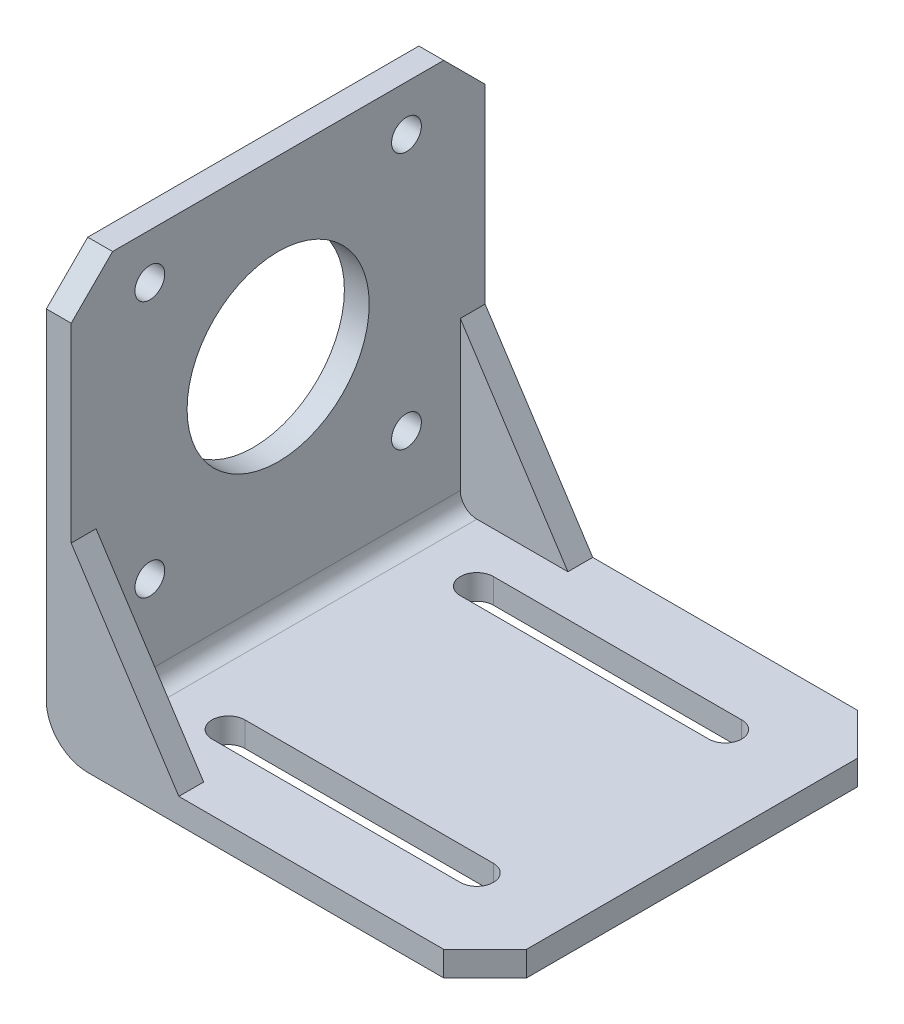
ISO-10303-21;
HEADER;
FILE_DESCRIPTION(('STEP AP214'),'2;1');
FILE_NAME('part.step','',(''),(''),'','','');
FILE_SCHEMA(('AUTOMOTIVE_DESIGN { 1 0 10303 214 1 1 1 1 }'));
ENDSEC;
DATA;
#1=APPLICATION_CONTEXT('core data for automotive mechanical design processes');
#2=APPLICATION_PROTOCOL_DEFINITION('international standard','automotive_design',2000,#1);
#3=PRODUCT_CONTEXT('',#1,'mechanical');
#4=PRODUCT('Part','Part','',(#3));
#5=PRODUCT_RELATED_PRODUCT_CATEGORY('part','',(#4));
#6=PRODUCT_DEFINITION_FORMATION('','',#4);
#7=PRODUCT_DEFINITION_CONTEXT('part definition',#1,'design');
#8=PRODUCT_DEFINITION('design','',#6,#7);
#9=PRODUCT_DEFINITION_SHAPE('','',#8);
#10=(LENGTH_UNIT() NAMED_UNIT(*) SI_UNIT(.MILLI.,.METRE.));
#11=(NAMED_UNIT(*) PLANE_ANGLE_UNIT() SI_UNIT($,.RADIAN.));
#12=(NAMED_UNIT(*) SI_UNIT($,.STERADIAN.) SOLID_ANGLE_UNIT());
#13=UNCERTAINTY_MEASURE_WITH_UNIT(LENGTH_MEASURE(1.E-05),#10,'distance_accuracy_value','');
#14=(GEOMETRIC_REPRESENTATION_CONTEXT(3) GLOBAL_UNCERTAINTY_ASSIGNED_CONTEXT((#13)) GLOBAL_UNIT_ASSIGNED_CONTEXT((#10,
#11,#12)) REPRESENTATION_CONTEXT('',''));
#15=CARTESIAN_POINT('',(0.,0.,0.));
#16=DIRECTION('',(0.,0.,1.));
#17=DIRECTION('',(1.,0.,0.));
#18=AXIS2_PLACEMENT_3D('',#15,#16,#17);
#19=CARTESIAN_POINT('',(-5.00000000000002,40.5,40.5));
#20=DIRECTION('',(1.,0.,0.));
#21=DIRECTION('',(0.,1.,0.));
#22=AXIS2_PLACEMENT_3D('',#19,#20,#21);
#23=CYLINDRICAL_SURFACE('',#22,1.79999999999999);
#24=CARTESIAN_POINT('',(-3.,40.5,40.5));
#25=DIRECTION('',(1.,0.,0.));
#26=DIRECTION('',(0.,1.,0.));
#27=AXIS2_PLACEMENT_3D('',#24,#25,#26);
#28=CIRCLE('',#27,1.79999999999999);
#29=CARTESIAN_POINT('',(-3.,42.3,40.5));
#30=VERTEX_POINT('',#29);
#31=EDGE_CURVE('E230',#30,#30,#28,.F.);
#32=ORIENTED_EDGE('',*,*,#31,.T.);
#33=EDGE_LOOP('',(#32));
#34=FACE_BOUND('',#33,.T.);
#35=CARTESIAN_POINT('',(0.,40.5,40.5));
#36=DIRECTION('',(1.,0.,0.));
#37=DIRECTION('',(0.,1.,0.));
#38=AXIS2_PLACEMENT_3D('',#35,#36,#37);
#39=CIRCLE('',#38,1.79999999999999);
#40=CARTESIAN_POINT('',(0.,42.3,40.5));
#41=VERTEX_POINT('',#40);
#42=EDGE_CURVE('E238',#41,#41,#39,.T.);
#43=ORIENTED_EDGE('',*,*,#42,.T.);
#44=EDGE_LOOP('',(#43));
#45=FACE_BOUND('',#44,.T.);
#46=ADVANCED_FACE('F16',(#34,#45),#23,.F.);
#47=CARTESIAN_POINT('',(-5.00000000000002,40.5,9.50000000000001));
#48=DIRECTION('',(1.,0.,0.));
#49=DIRECTION('',(0.,1.,0.));
#50=AXIS2_PLACEMENT_3D('',#47,#48,#49);
#51=CYLINDRICAL_SURFACE('',#50,1.8);
#52=CARTESIAN_POINT('',(-3.,40.5,9.50000000000001));
#53=DIRECTION('',(1.,0.,0.));
#54=DIRECTION('',(0.,1.,0.));
#55=AXIS2_PLACEMENT_3D('',#52,#53,#54);
#56=CIRCLE('',#55,1.8);
#57=CARTESIAN_POINT('',(-3.,42.3,9.50000000000001));
#58=VERTEX_POINT('',#57);
#59=EDGE_CURVE('E311',#58,#58,#56,.F.);
#60=ORIENTED_EDGE('',*,*,#59,.T.);
#61=EDGE_LOOP('',(#60));
#62=FACE_BOUND('',#61,.T.);
#63=CARTESIAN_POINT('',(0.,40.5,9.50000000000001));
#64=DIRECTION('',(1.,0.,0.));
#65=DIRECTION('',(0.,1.,0.));
#66=AXIS2_PLACEMENT_3D('',#63,#64,#65);
#67=CIRCLE('',#66,1.8);
#68=CARTESIAN_POINT('',(0.,42.3,9.50000000000001));
#69=VERTEX_POINT('',#68);
#70=EDGE_CURVE('E318',#69,#69,#67,.T.);
#71=ORIENTED_EDGE('',*,*,#70,.T.);
#72=EDGE_LOOP('',(#71));
#73=FACE_BOUND('',#72,.T.);
#74=ADVANCED_FACE('F619',(#62,#73),#51,.F.);
#75=CARTESIAN_POINT('',(-5.,9.49999999999999,9.49999999999999));
#76=DIRECTION('',(1.,0.,0.));
#77=DIRECTION('',(0.,1.,0.));
#78=AXIS2_PLACEMENT_3D('',#75,#76,#77);
#79=CYLINDRICAL_SURFACE('',#78,1.8);
#80=CARTESIAN_POINT('',(-3.,9.49999999999999,9.49999999999999));
#81=DIRECTION('',(1.,0.,0.));
#82=DIRECTION('',(0.,1.,0.));
#83=AXIS2_PLACEMENT_3D('',#80,#81,#82);
#84=CIRCLE('',#83,1.8);
#85=CARTESIAN_POINT('',(-3.,11.3,9.49999999999999));
#86=VERTEX_POINT('',#85);
#87=EDGE_CURVE('E308',#86,#86,#84,.F.);
#88=ORIENTED_EDGE('',*,*,#87,.T.);
#89=EDGE_LOOP('',(#88));
#90=FACE_BOUND('',#89,.T.);
#91=CARTESIAN_POINT('',(0.,9.5,9.49999999999999));
#92=DIRECTION('',(1.,0.,0.));
#93=DIRECTION('',(0.,1.,0.));
#94=AXIS2_PLACEMENT_3D('',#91,#92,#93);
#95=CIRCLE('',#94,1.8);
#96=CARTESIAN_POINT('',(0.,11.3,9.49999999999999));
#97=VERTEX_POINT('',#96);
#98=EDGE_CURVE('E321',#97,#97,#95,.T.);
#99=ORIENTED_EDGE('',*,*,#98,.T.);
#100=EDGE_LOOP('',(#99));
#101=FACE_BOUND('',#100,.T.);
#102=ADVANCED_FACE('F616',(#90,#101),#79,.F.);
#103=CARTESIAN_POINT('',(-5.,9.49999999999999,40.5));
#104=DIRECTION('',(1.,0.,0.));
#105=DIRECTION('',(0.,1.,0.));
#106=AXIS2_PLACEMENT_3D('',#103,#104,#105);
#107=CYLINDRICAL_SURFACE('',#106,1.79999999999999);
#108=CARTESIAN_POINT('',(-3.,9.49999999999999,40.5));
#109=DIRECTION('',(1.,0.,0.));
#110=DIRECTION('',(0.,1.,0.));
#111=AXIS2_PLACEMENT_3D('',#108,#109,#110);
#112=CIRCLE('',#111,1.79999999999999);
#113=CARTESIAN_POINT('',(-3.,11.3,40.5));
#114=VERTEX_POINT('',#113);
#115=EDGE_CURVE('E305',#114,#114,#112,.F.);
#116=ORIENTED_EDGE('',*,*,#115,.T.);
#117=EDGE_LOOP('',(#116));
#118=FACE_BOUND('',#117,.T.);
#119=CARTESIAN_POINT('',(0.,9.49999999999999,40.5));
#120=DIRECTION('',(1.,0.,0.));
#121=DIRECTION('',(0.,1.,0.));
#122=AXIS2_PLACEMENT_3D('',#119,#120,#121);
#123=CIRCLE('',#122,1.79999999999999);
#124=CARTESIAN_POINT('',(0.,11.3,40.5));
#125=VERTEX_POINT('',#124);
#126=EDGE_CURVE('E324',#125,#125,#123,.T.);
#127=ORIENTED_EDGE('',*,*,#126,.T.);
#128=EDGE_LOOP('',(#127));
#129=FACE_BOUND('',#128,.T.);
#130=ADVANCED_FACE('F612',(#118,#129),#107,.F.);
#131=CARTESIAN_POINT('',(-5.00000000000001,25.,25.));
#132=DIRECTION('',(1.,0.,0.));
#133=DIRECTION('',(0.,1.,0.));
#134=AXIS2_PLACEMENT_3D('',#131,#132,#133);
#135=CYLINDRICAL_SURFACE('',#134,11.);
#136=CARTESIAN_POINT('',(-3.,25.,25.));
#137=DIRECTION('',(1.,0.,0.));
#138=DIRECTION('',(0.,1.,0.));
#139=AXIS2_PLACEMENT_3D('',#136,#137,#138);
#140=CIRCLE('',#139,11.);
#141=CARTESIAN_POINT('',(-3.,36.,25.));
#142=VERTEX_POINT('',#141);
#143=EDGE_CURVE('E301',#142,#142,#140,.F.);
#144=ORIENTED_EDGE('',*,*,#143,.T.);
#145=EDGE_LOOP('',(#144));
#146=FACE_BOUND('',#145,.T.);
#147=CARTESIAN_POINT('',(0.,25.,25.));
#148=DIRECTION('',(1.,0.,0.));
#149=DIRECTION('',(0.,1.,0.));
#150=AXIS2_PLACEMENT_3D('',#147,#148,#149);
#151=CIRCLE('',#150,11.);
#152=CARTESIAN_POINT('',(0.,36.,25.));
#153=VERTEX_POINT('',#152);
#154=EDGE_CURVE('E327',#153,#153,#151,.T.);
#155=ORIENTED_EDGE('',*,*,#154,.T.);
#156=EDGE_LOOP('',(#155));
#157=FACE_BOUND('',#156,.T.);
#158=ADVANCED_FACE('F608',(#146,#157),#135,.F.);
#159=CARTESIAN_POINT('',(-3.,46.,50.));
#160=DIRECTION('',(0.,-1.,0.));
#161=DIRECTION('',(0.,0.,-1.));
#162=AXIS2_PLACEMENT_3D('',#159,#160,#161);
#163=PLANE('',#162);
#164=DIRECTION('',(1.,0.,0.));
#165=VECTOR('',#164,1.);
#166=CARTESIAN_POINT('',(-3.,46.,4.99999999999999));
#167=LINE('',#166,#165);
#168=CARTESIAN_POINT('',(0.,46.,4.99999999999998));
#169=VERTEX_POINT('',#168);
#170=CARTESIAN_POINT('',(-3.,46.,4.99999999999999));
#171=VERTEX_POINT('',#170);
#172=EDGE_CURVE('E220',#169,#171,#167,.F.);
#173=ORIENTED_EDGE('',*,*,#172,.T.);
#174=DIRECTION('',(0.,0.,-1.));
#175=VECTOR('',#174,1.);
#176=CARTESIAN_POINT('',(-3.,46.,50.));
#177=LINE('',#176,#175);
#178=CARTESIAN_POINT('',(-3.,46.,45.));
#179=VERTEX_POINT('',#178);
#180=EDGE_CURVE('E199',#171,#179,#177,.F.);
#181=ORIENTED_EDGE('',*,*,#180,.T.);
#182=DIRECTION('',(1.,0.,0.));
#183=VECTOR('',#182,1.);
#184=CARTESIAN_POINT('',(2.,46.,45.));
#185=LINE('',#184,#183);
#186=CARTESIAN_POINT('',(0.,46.,45.));
#187=VERTEX_POINT('',#186);
#188=EDGE_CURVE('E228',#187,#179,#185,.F.);
#189=ORIENTED_EDGE('',*,*,#188,.F.);
#190=DIRECTION('',(0.,0.,1.));
#191=VECTOR('',#190,1.);
#192=CARTESIAN_POINT('',(0.,46.,50.));
#193=LINE('',#192,#191);
#194=EDGE_CURVE('E234',#187,#169,#193,.F.);
#195=ORIENTED_EDGE('',*,*,#194,.T.);
#196=EDGE_LOOP('',(#173,#181,#189,#195));
#197=FACE_BOUND('',#196,.T.);
#198=ADVANCED_FACE('F605',(#197),#163,.F.);
#199=CARTESIAN_POINT('',(0.,0.,47.));
#200=DIRECTION('',(0.,0.,-1.));
#201=DIRECTION('',(-1.,0.,0.));
#202=AXIS2_PLACEMENT_3D('',#199,#200,#201);
#203=PLANE('',#202);
#204=DIRECTION('',(0.544988350595414,-0.838443616300637,0.));
#205=VECTOR('',#204,1.);
#206=CARTESIAN_POINT('',(0.,18.,47.));
#207=LINE('',#206,#205);
#208=CARTESIAN_POINT('',(0.,18.,47.));
#209=VERTEX_POINT('',#208);
#210=CARTESIAN_POINT('',(13.,-2.,47.));
#211=VERTEX_POINT('',#210);
#212=EDGE_CURVE('E197',#209,#211,#207,.T.);
#213=ORIENTED_EDGE('',*,*,#212,.T.);
#214=DIRECTION('',(1.,0.,0.));
#215=VECTOR('',#214,1.);
#216=CARTESIAN_POINT('',(2.,-2.,47.));
#217=LINE('',#216,#215);
#218=CARTESIAN_POINT('',(2.,-2.,47.));
#219=VERTEX_POINT('',#218);
#220=EDGE_CURVE('E190',#211,#219,#217,.F.);
#221=ORIENTED_EDGE('',*,*,#220,.T.);
#222=CARTESIAN_POINT('',(2.,0.,47.));
#223=DIRECTION('',(0.,0.,-1.));
#224=DIRECTION('',(-1.,0.,0.));
#225=AXIS2_PLACEMENT_3D('',#222,#223,#224);
#226=CIRCLE('',#225,2.);
#227=CARTESIAN_POINT('',(0.,0.,47.));
#228=VERTEX_POINT('',#227);
#229=EDGE_CURVE('E19',#219,#228,#226,.T.);
#230=ORIENTED_EDGE('',*,*,#229,.T.);
#231=DIRECTION('',(0.,-1.,0.));
#232=VECTOR('',#231,1.);
#233=CARTESIAN_POINT('',(0.,0.,47.));
#234=LINE('',#233,#232);
#235=EDGE_CURVE('E241',#228,#209,#234,.F.);
#236=ORIENTED_EDGE('',*,*,#235,.T.);
#237=EDGE_LOOP('',(#213,#221,#230,#236));
#238=FACE_BOUND('',#237,.T.);
#239=ADVANCED_FACE('F196',(#238),#203,.T.);
#240=CARTESIAN_POINT('',(2.,0.,50.));
#241=DIRECTION('',(0.,0.,-1.));
#242=DIRECTION('',(-1.,0.,0.));
#243=AXIS2_PLACEMENT_3D('',#240,#241,#242);
#244=CYLINDRICAL_SURFACE('',#243,2.);
#245=ORIENTED_EDGE('',*,*,#229,.F.);
#246=DIRECTION('',(0.,0.,1.));
#247=VECTOR('',#246,1.);
#248=CARTESIAN_POINT('',(2.,-2.,50.));
#249=LINE('',#248,#247);
#250=CARTESIAN_POINT('',(2.,-2.,3.));
#251=VERTEX_POINT('',#250);
#252=EDGE_CURVE('E177',#219,#251,#249,.F.);
#253=ORIENTED_EDGE('',*,*,#252,.T.);
#254=CARTESIAN_POINT('',(2.,0.,3.));
#255=DIRECTION('',(0.,0.,-1.));
#256=DIRECTION('',(-1.,0.,0.));
#257=AXIS2_PLACEMENT_3D('',#254,#255,#256);
#258=CIRCLE('',#257,2.);
#259=CARTESIAN_POINT('',(0.,0.,3.));
#260=VERTEX_POINT('',#259);
#261=EDGE_CURVE('E184',#260,#251,#258,.F.);
#262=ORIENTED_EDGE('',*,*,#261,.F.);
#263=DIRECTION('',(0.,0.,1.));
#264=VECTOR('',#263,1.);
#265=CARTESIAN_POINT('',(0.,0.,50.));
#266=LINE('',#265,#264);
#267=EDGE_CURVE('E179',#260,#228,#266,.T.);
#268=ORIENTED_EDGE('',*,*,#267,.T.);
#269=EDGE_LOOP('',(#245,#253,#262,#268));
#270=FACE_BOUND('',#269,.T.);
#271=ADVANCED_FACE('F176',(#270),#244,.F.);
#272=CARTESIAN_POINT('',(0.,0.,3.));
#273=DIRECTION('',(0.,0.,1.));
#274=DIRECTION('',(1.,0.,0.));
#275=AXIS2_PLACEMENT_3D('',#272,#273,#274);
#276=PLANE('',#275);
#277=DIRECTION('',(-0.544988350595414,0.838443616300637,0.));
#278=VECTOR('',#277,1.);
#279=CARTESIAN_POINT('',(0.,18.,3.));
#280=LINE('',#279,#278);
#281=CARTESIAN_POINT('',(0.,18.,3.));
#282=VERTEX_POINT('',#281);
#283=CARTESIAN_POINT('',(13.,-2.,3.));
#284=VERTEX_POINT('',#283);
#285=EDGE_CURVE('E218',#282,#284,#280,.F.);
#286=ORIENTED_EDGE('',*,*,#285,.F.);
#287=DIRECTION('',(0.,-1.,0.));
#288=VECTOR('',#287,1.);
#289=CARTESIAN_POINT('',(0.,0.,3.));
#290=LINE('',#289,#288);
#291=EDGE_CURVE('E247',#282,#260,#290,.T.);
#292=ORIENTED_EDGE('',*,*,#291,.T.);
#293=ORIENTED_EDGE('',*,*,#261,.T.);
#294=DIRECTION('',(1.,0.,0.));
#295=VECTOR('',#294,1.);
#296=CARTESIAN_POINT('',(2.,-2.,3.));
#297=LINE('',#296,#295);
#298=EDGE_CURVE('E194',#251,#284,#297,.T.);
#299=ORIENTED_EDGE('',*,*,#298,.T.);
#300=EDGE_LOOP('',(#286,#292,#293,#299));
#301=FACE_BOUND('',#300,.T.);
#302=ADVANCED_FACE('F330',(#301),#276,.T.);
#303=CARTESIAN_POINT('',(-3.,46.,4.99999999999999));
#304=DIRECTION('',(0.,-0.707106781186546,0.707106781186549));
#305=DIRECTION('',(0.,-0.707106781186549,-0.707106781186546));
#306=AXIS2_PLACEMENT_3D('',#303,#304,#305);
#307=PLANE('',#306);
#308=DIRECTION('',(1.,0.,0.));
#309=VECTOR('',#308,1.);
#310=CARTESIAN_POINT('',(2.,41.,0.));
#311=LINE('',#310,#309);
#312=CARTESIAN_POINT('',(0.,41.,0.));
#313=VERTEX_POINT('',#312);
#314=CARTESIAN_POINT('',(-3.,41.,0.));
#315=VERTEX_POINT('',#314);
#316=EDGE_CURVE('E360',#313,#315,#311,.F.);
#317=ORIENTED_EDGE('',*,*,#316,.T.);
#318=DIRECTION('',(0.,0.707106781186548,0.707106781186546));
#319=VECTOR('',#318,1.);
#320=CARTESIAN_POINT('',(-3.,41.,0.));
#321=LINE('',#320,#319);
#322=EDGE_CURVE('E202',#315,#171,#321,.T.);
#323=ORIENTED_EDGE('',*,*,#322,.T.);
#324=ORIENTED_EDGE('',*,*,#172,.F.);
#325=DIRECTION('',(0.,-0.707106781186548,-0.707106781186546));
#326=VECTOR('',#325,1.);
#327=CARTESIAN_POINT('',(0.,46.,4.99999999999999));
#328=LINE('',#327,#326);
#329=EDGE_CURVE('E237',#169,#313,#328,.T.);
#330=ORIENTED_EDGE('',*,*,#329,.T.);
#331=EDGE_LOOP('',(#317,#323,#324,#330));
#332=FACE_BOUND('',#331,.T.);
#333=ADVANCED_FACE('F583',(#332),#307,.F.);
#334=CARTESIAN_POINT('',(0.,18.,3.));
#335=DIRECTION('',(0.838443616300637,0.544988350595414,0.));
#336=DIRECTION('',(-0.544988350595414,0.838443616300637,0.));
#337=AXIS2_PLACEMENT_3D('',#334,#335,#336);
#338=PLANE('',#337);
#339=ORIENTED_EDGE('',*,*,#285,.T.);
#340=DIRECTION('',(0.,0.,1.));
#341=VECTOR('',#340,1.);
#342=CARTESIAN_POINT('',(13.,-2.,50.));
#343=LINE('',#342,#341);
#344=CARTESIAN_POINT('',(13.,-2.,0.));
#345=VERTEX_POINT('',#344);
#346=EDGE_CURVE('E211',#284,#345,#343,.F.);
#347=ORIENTED_EDGE('',*,*,#346,.T.);
#348=DIRECTION('',(-0.544988350595414,0.838443616300637,0.));
#349=VECTOR('',#348,1.);
#350=CARTESIAN_POINT('',(13.,-2.,0.));
#351=LINE('',#350,#349);
#352=CARTESIAN_POINT('',(0.,18.,0.));
#353=VERTEX_POINT('',#352);
#354=EDGE_CURVE('E257',#345,#353,#351,.T.);
#355=ORIENTED_EDGE('',*,*,#354,.T.);
#356=DIRECTION('',(0.,0.,1.));
#357=VECTOR('',#356,1.);
#358=CARTESIAN_POINT('',(0.,18.,50.));
#359=LINE('',#358,#357);
#360=EDGE_CURVE('E250',#353,#282,#359,.T.);
#361=ORIENTED_EDGE('',*,*,#360,.T.);
#362=EDGE_LOOP('',(#339,#347,#355,#361));
#363=FACE_BOUND('',#362,.T.);
#364=ADVANCED_FACE('F585',(#363),#338,.T.);
#365=CARTESIAN_POINT('',(0.,18.,47.));
#366=DIRECTION('',(-0.838443616300637,-0.544988350595414,0.));
#367=DIRECTION('',(0.544988350595414,-0.838443616300637,0.));
#368=AXIS2_PLACEMENT_3D('',#365,#366,#367);
#369=PLANE('',#368);
#370=DIRECTION('',(0.,0.,1.));
#371=VECTOR('',#370,1.);
#372=CARTESIAN_POINT('',(13.,-2.,50.));
#373=LINE('',#372,#371);
#374=CARTESIAN_POINT('',(13.,-2.,50.));
#375=VERTEX_POINT('',#374);
#376=EDGE_CURVE('E215',#375,#211,#373,.F.);
#377=ORIENTED_EDGE('',*,*,#376,.T.);
#378=ORIENTED_EDGE('',*,*,#212,.F.);
#379=DIRECTION('',(0.,0.,1.));
#380=VECTOR('',#379,1.);
#381=CARTESIAN_POINT('',(0.,18.,50.));
#382=LINE('',#381,#380);
#383=CARTESIAN_POINT('',(0.,18.,50.));
#384=VERTEX_POINT('',#383);
#385=EDGE_CURVE('E243',#209,#384,#382,.T.);
#386=ORIENTED_EDGE('',*,*,#385,.T.);
#387=DIRECTION('',(-0.544988350595414,0.838443616300637,0.));
#388=VECTOR('',#387,1.);
#389=CARTESIAN_POINT('',(13.,-2.,50.));
#390=LINE('',#389,#388);
#391=EDGE_CURVE('E418',#375,#384,#390,.T.);
#392=ORIENTED_EDGE('',*,*,#391,.F.);
#393=EDGE_LOOP('',(#377,#378,#386,#392));
#394=FACE_BOUND('',#393,.T.);
#395=ADVANCED_FACE('F586',(#394),#369,.F.);
#396=CARTESIAN_POINT('',(0.,0.,50.));
#397=DIRECTION('',(-1.,0.,0.));
#398=DIRECTION('',(0.,-1.,0.));
#399=AXIS2_PLACEMENT_3D('',#396,#397,#398);
#400=PLANE('',#399);
#401=ORIENTED_EDGE('',*,*,#235,.F.);
#402=ORIENTED_EDGE('',*,*,#267,.F.);
#403=ORIENTED_EDGE('',*,*,#291,.F.);
#404=ORIENTED_EDGE('',*,*,#360,.F.);
#405=DIRECTION('',(0.,1.,0.));
#406=VECTOR('',#405,1.);
#407=CARTESIAN_POINT('',(0.,0.,0.));
#408=LINE('',#407,#406);
#409=EDGE_CURVE('E260',#353,#313,#408,.T.);
#410=ORIENTED_EDGE('',*,*,#409,.T.);
#411=ORIENTED_EDGE('',*,*,#329,.F.);
#412=ORIENTED_EDGE('',*,*,#194,.F.);
#413=DIRECTION('',(0.,-0.707106781186546,0.707106781186549));
#414=VECTOR('',#413,1.);
#415=CARTESIAN_POINT('',(0.,41.,50.));
#416=LINE('',#415,#414);
#417=CARTESIAN_POINT('',(0.,41.,50.));
#418=VERTEX_POINT('',#417);
#419=EDGE_CURVE('E231',#418,#187,#416,.F.);
#420=ORIENTED_EDGE('',*,*,#419,.F.);
#421=DIRECTION('',(0.,1.,0.));
#422=VECTOR('',#421,1.);
#423=CARTESIAN_POINT('',(0.,0.,50.));
#424=LINE('',#423,#422);
#425=EDGE_CURVE('E339',#384,#418,#424,.T.);
#426=ORIENTED_EDGE('',*,*,#425,.F.);
#427=ORIENTED_EDGE('',*,*,#385,.F.);
#428=EDGE_LOOP('',(#401,#402,#403,#404,#410,#411,#412,#420,#426,#427));
#429=FACE_BOUND('',#428,.T.);
#430=ORIENTED_EDGE('',*,*,#42,.F.);
#431=EDGE_LOOP('',(#430));
#432=FACE_BOUND('',#431,.T.);
#433=ORIENTED_EDGE('',*,*,#70,.F.);
#434=EDGE_LOOP('',(#433));
#435=FACE_BOUND('',#434,.T.);
#436=ORIENTED_EDGE('',*,*,#98,.F.);
#437=EDGE_LOOP('',(#436));
#438=FACE_BOUND('',#437,.T.);
#439=ORIENTED_EDGE('',*,*,#126,.F.);
#440=EDGE_LOOP('',(#439));
#441=FACE_BOUND('',#440,.T.);
#442=ORIENTED_EDGE('',*,*,#154,.F.);
#443=EDGE_LOOP('',(#442));
#444=FACE_BOUND('',#443,.T.);
#445=ADVANCED_FACE('F333',(#429,#432,#435,#438,#441,#444),#400,.F.);
#446=CARTESIAN_POINT('',(2.,41.,50.));
#447=DIRECTION('',(0.,0.707106781186549,0.707106781186546));
#448=DIRECTION('',(0.,-0.707106781186546,0.707106781186549));
#449=AXIS2_PLACEMENT_3D('',#446,#447,#448);
#450=PLANE('',#449);
#451=DIRECTION('',(0.,-0.707106781186546,0.707106781186548));
#452=VECTOR('',#451,1.);
#453=CARTESIAN_POINT('',(-3.,46.,45.));
#454=LINE('',#453,#452);
#455=CARTESIAN_POINT('',(-3.,41.,50.));
#456=VERTEX_POINT('',#455);
#457=EDGE_CURVE('E304',#179,#456,#454,.T.);
#458=ORIENTED_EDGE('',*,*,#457,.T.);
#459=DIRECTION('',(1.,0.,0.));
#460=VECTOR('',#459,1.);
#461=CARTESIAN_POINT('',(2.,41.,50.));
#462=LINE('',#461,#460);
#463=EDGE_CURVE('E428',#418,#456,#462,.F.);
#464=ORIENTED_EDGE('',*,*,#463,.F.);
#465=ORIENTED_EDGE('',*,*,#419,.T.);
#466=ORIENTED_EDGE('',*,*,#188,.T.);
#467=EDGE_LOOP('',(#458,#464,#465,#466));
#468=FACE_BOUND('',#467,.T.);
#469=ADVANCED_FACE('F440',(#468),#450,.T.);
#470=CARTESIAN_POINT('',(-3.,0.,50.));
#471=DIRECTION('',(1.,0.,0.));
#472=DIRECTION('',(0.,0.,-1.));
#473=AXIS2_PLACEMENT_3D('',#470,#471,#472);
#474=PLANE('',#473);
#475=ORIENTED_EDGE('',*,*,#322,.F.);
#476=DIRECTION('',(0.,1.,0.));
#477=VECTOR('',#476,1.);
#478=CARTESIAN_POINT('',(-3.,0.,0.));
#479=LINE('',#478,#477);
#480=CARTESIAN_POINT('',(-3.,0.,0.));
#481=VERTEX_POINT('',#480);
#482=EDGE_CURVE('E363',#315,#481,#479,.F.);
#483=ORIENTED_EDGE('',*,*,#482,.T.);
#484=DIRECTION('',(0.,0.,-1.));
#485=VECTOR('',#484,1.);
#486=CARTESIAN_POINT('',(-3.,0.,50.));
#487=LINE('',#486,#485);
#488=CARTESIAN_POINT('',(-3.,0.,50.));
#489=VERTEX_POINT('',#488);
#490=EDGE_CURVE('E285',#489,#481,#487,.T.);
#491=ORIENTED_EDGE('',*,*,#490,.F.);
#492=DIRECTION('',(0.,1.,0.));
#493=VECTOR('',#492,1.);
#494=CARTESIAN_POINT('',(-3.,0.,50.));
#495=LINE('',#494,#493);
#496=EDGE_CURVE('E282',#456,#489,#495,.F.);
#497=ORIENTED_EDGE('',*,*,#496,.F.);
#498=ORIENTED_EDGE('',*,*,#457,.F.);
#499=ORIENTED_EDGE('',*,*,#180,.F.);
#500=EDGE_LOOP('',(#475,#483,#491,#497,#498,#499));
#501=FACE_BOUND('',#500,.T.);
#502=ORIENTED_EDGE('',*,*,#143,.F.);
#503=EDGE_LOOP('',(#502));
#504=FACE_BOUND('',#503,.T.);
#505=ORIENTED_EDGE('',*,*,#115,.F.);
#506=EDGE_LOOP('',(#505));
#507=FACE_BOUND('',#506,.T.);
#508=ORIENTED_EDGE('',*,*,#87,.F.);
#509=EDGE_LOOP('',(#508));
#510=FACE_BOUND('',#509,.T.);
#511=ORIENTED_EDGE('',*,*,#59,.F.);
#512=EDGE_LOOP('',(#511));
#513=FACE_BOUND('',#512,.T.);
#514=ORIENTED_EDGE('',*,*,#31,.F.);
#515=EDGE_LOOP('',(#514));
#516=FACE_BOUND('',#515,.T.);
#517=ADVANCED_FACE('F446',(#501,#504,#507,#510,#513,#516),#474,.F.);
#518=CARTESIAN_POINT('',(2.,-2.,50.));
#519=DIRECTION('',(0.,-1.,0.));
#520=DIRECTION('',(1.,0.,0.));
#521=AXIS2_PLACEMENT_3D('',#518,#519,#520);
#522=PLANE('',#521);
#523=DIRECTION('',(1.,0.,0.));
#524=VECTOR('',#523,1.);
#525=CARTESIAN_POINT('',(2.,-2.,50.));
#526=LINE('',#525,#524);
#527=CARTESIAN_POINT('',(45.,-2.,50.));
#528=VERTEX_POINT('',#527);
#529=EDGE_CURVE('E281',#528,#375,#526,.F.);
#530=ORIENTED_EDGE('',*,*,#529,.F.);
#531=DIRECTION('',(0.707106781186547,0.,-0.707106781186549));
#532=VECTOR('',#531,1.);
#533=CARTESIAN_POINT('',(45.,-2.,50.));
#534=LINE('',#533,#532);
#535=CARTESIAN_POINT('',(50.,-2.,45.));
#536=VERTEX_POINT('',#535);
#537=EDGE_CURVE('E404',#536,#528,#534,.F.);
#538=ORIENTED_EDGE('',*,*,#537,.F.);
#539=DIRECTION('',(0.,0.,1.));
#540=VECTOR('',#539,1.);
#541=CARTESIAN_POINT('',(50.,-2.,50.));
#542=LINE('',#541,#540);
#543=CARTESIAN_POINT('',(50.,-2.,4.99999999999999));
#544=VERTEX_POINT('',#543);
#545=EDGE_CURVE('E278',#536,#544,#542,.F.);
#546=ORIENTED_EDGE('',*,*,#545,.T.);
#547=DIRECTION('',(0.707106781186549,0.,0.707106781186546));
#548=VECTOR('',#547,1.);
#549=CARTESIAN_POINT('',(50.,-2.,4.99999999999999));
#550=LINE('',#549,#548);
#551=CARTESIAN_POINT('',(45.,-2.,0.));
#552=VERTEX_POINT('',#551);
#553=EDGE_CURVE('E364',#544,#552,#550,.F.);
#554=ORIENTED_EDGE('',*,*,#553,.T.);
#555=DIRECTION('',(1.,0.,0.));
#556=VECTOR('',#555,1.);
#557=CARTESIAN_POINT('',(2.,-2.,0.));
#558=LINE('',#557,#556);
#559=EDGE_CURVE('E261',#552,#345,#558,.F.);
#560=ORIENTED_EDGE('',*,*,#559,.T.);
#561=ORIENTED_EDGE('',*,*,#346,.F.);
#562=ORIENTED_EDGE('',*,*,#298,.F.);
#563=ORIENTED_EDGE('',*,*,#252,.F.);
#564=ORIENTED_EDGE('',*,*,#220,.F.);
#565=ORIENTED_EDGE('',*,*,#376,.F.);
#566=EDGE_LOOP('',(#530,#538,#546,#554,#560,#561,#562,#563,#564,#565));
#567=FACE_BOUND('',#566,.T.);
#568=DIRECTION('',(1.,0.,0.));
#569=VECTOR('',#568,1.);
#570=CARTESIAN_POINT('',(8.99999999999999,-2.,12.));
#571=LINE('',#570,#569);
#572=CARTESIAN_POINT('',(39.,-2.,12.));
#573=VERTEX_POINT('',#572);
#574=CARTESIAN_POINT('',(8.99999999999999,-2.,12.));
#575=VERTEX_POINT('',#574);
#576=EDGE_CURVE('E385',#573,#575,#571,.F.);
#577=ORIENTED_EDGE('',*,*,#576,.T.);
#578=CARTESIAN_POINT('',(8.99999999999999,-2.,9.99999999999999));
#579=DIRECTION('',(0.,1.,0.));
#580=DIRECTION('',(-1.,0.,0.));
#581=AXIS2_PLACEMENT_3D('',#578,#579,#580);
#582=CIRCLE('',#581,2.);
#583=CARTESIAN_POINT('',(8.99999999999999,-2.,7.99999999999998));
#584=VERTEX_POINT('',#583);
#585=EDGE_CURVE('E294',#575,#584,#582,.F.);
#586=ORIENTED_EDGE('',*,*,#585,.T.);
#587=DIRECTION('',(-1.,0.,0.));
#588=VECTOR('',#587,1.);
#589=CARTESIAN_POINT('',(8.99999999999999,-2.,7.99999999999998));
#590=LINE('',#589,#588);
#591=CARTESIAN_POINT('',(39.,-2.,7.99999999999998));
#592=VERTEX_POINT('',#591);
#593=EDGE_CURVE('E382',#584,#592,#590,.F.);
#594=ORIENTED_EDGE('',*,*,#593,.T.);
#595=CARTESIAN_POINT('',(39.,-2.,9.99999999999998));
#596=DIRECTION('',(0.,1.,0.));
#597=DIRECTION('',(-1.,0.,0.));
#598=AXIS2_PLACEMENT_3D('',#595,#596,#597);
#599=CIRCLE('',#598,2.);
#600=EDGE_CURVE('E298',#592,#573,#599,.F.);
#601=ORIENTED_EDGE('',*,*,#600,.T.);
#602=EDGE_LOOP('',(#577,#586,#594,#601));
#603=FACE_BOUND('',#602,.T.);
#604=DIRECTION('',(1.,0.,0.));
#605=VECTOR('',#604,1.);
#606=CARTESIAN_POINT('',(8.99999999999999,-2.,42.));
#607=LINE('',#606,#605);
#608=CARTESIAN_POINT('',(39.,-2.,42.));
#609=VERTEX_POINT('',#608);
#610=CARTESIAN_POINT('',(8.99999999999999,-2.,42.));
#611=VERTEX_POINT('',#610);
#612=EDGE_CURVE('E379',#609,#611,#607,.F.);
#613=ORIENTED_EDGE('',*,*,#612,.T.);
#614=CARTESIAN_POINT('',(8.99999999999999,-2.,40.));
#615=DIRECTION('',(0.,1.,0.));
#616=DIRECTION('',(-1.,0.,0.));
#617=AXIS2_PLACEMENT_3D('',#614,#615,#616);
#618=CIRCLE('',#617,2.);
#619=CARTESIAN_POINT('',(8.99999999999999,-2.,38.));
#620=VERTEX_POINT('',#619);
#621=EDGE_CURVE('E286',#611,#620,#618,.F.);
#622=ORIENTED_EDGE('',*,*,#621,.T.);
#623=DIRECTION('',(-1.,0.,0.));
#624=VECTOR('',#623,1.);
#625=CARTESIAN_POINT('',(8.99999999999999,-2.,38.));
#626=LINE('',#625,#624);
#627=CARTESIAN_POINT('',(39.,-2.,38.));
#628=VERTEX_POINT('',#627);
#629=EDGE_CURVE('E375',#620,#628,#626,.F.);
#630=ORIENTED_EDGE('',*,*,#629,.T.);
#631=CARTESIAN_POINT('',(39.,-2.,40.));
#632=DIRECTION('',(0.,1.,0.));
#633=DIRECTION('',(-1.,0.,0.));
#634=AXIS2_PLACEMENT_3D('',#631,#632,#633);
#635=CIRCLE('',#634,2.);
#636=EDGE_CURVE('E290',#628,#609,#635,.F.);
#637=ORIENTED_EDGE('',*,*,#636,.T.);
#638=EDGE_LOOP('',(#613,#622,#630,#637));
#639=FACE_BOUND('',#638,.T.);
#640=ADVANCED_FACE('F188',(#567,#603,#639),#522,.F.);
#641=CARTESIAN_POINT('',(39.,-7.,9.99999999999998));
#642=DIRECTION('',(0.,1.,0.));
#643=DIRECTION('',(-1.,0.,0.));
#644=AXIS2_PLACEMENT_3D('',#641,#642,#643);
#645=CYLINDRICAL_SURFACE('',#644,2.);
#646=ORIENTED_EDGE('',*,*,#600,.F.);
#647=DIRECTION('',(0.,1.,0.));
#648=VECTOR('',#647,1.);
#649=CARTESIAN_POINT('',(39.,-7.,7.99999999999998));
#650=LINE('',#649,#648);
#651=CARTESIAN_POINT('',(39.,-5.,7.99999999999998));
#652=VERTEX_POINT('',#651);
#653=EDGE_CURVE('E293',#592,#652,#650,.F.);
#654=ORIENTED_EDGE('',*,*,#653,.T.);
#655=CARTESIAN_POINT('',(39.,-5.,9.99999999999998));
#656=DIRECTION('',(0.,1.,0.));
#657=DIRECTION('',(-1.,0.,0.));
#658=AXIS2_PLACEMENT_3D('',#655,#656,#657);
#659=CIRCLE('',#658,2.);
#660=CARTESIAN_POINT('',(39.,-5.,12.));
#661=VERTEX_POINT('',#660);
#662=EDGE_CURVE('E275',#652,#661,#659,.F.);
#663=ORIENTED_EDGE('',*,*,#662,.T.);
#664=DIRECTION('',(0.,1.,0.));
#665=VECTOR('',#664,1.);
#666=CARTESIAN_POINT('',(39.,-7.,12.));
#667=LINE('',#666,#665);
#668=EDGE_CURVE('E300',#661,#573,#667,.T.);
#669=ORIENTED_EDGE('',*,*,#668,.T.);
#670=EDGE_LOOP('',(#646,#654,#663,#669));
#671=FACE_BOUND('',#670,.T.);
#672=ADVANCED_FACE('F505',(#671),#645,.F.);
#673=CARTESIAN_POINT('',(8.99999999999999,-7.,12.));
#674=DIRECTION('',(0.,0.,1.));
#675=DIRECTION('',(1.,0.,0.));
#676=AXIS2_PLACEMENT_3D('',#673,#674,#675);
#677=PLANE('',#676);
#678=ORIENTED_EDGE('',*,*,#576,.F.);
#679=ORIENTED_EDGE('',*,*,#668,.F.);
#680=DIRECTION('',(1.,0.,0.));
#681=VECTOR('',#680,1.);
#682=CARTESIAN_POINT('',(2.,-5.,12.));
#683=LINE('',#682,#681);
#684=CARTESIAN_POINT('',(8.99999999999999,-5.,12.));
#685=VERTEX_POINT('',#684);
#686=EDGE_CURVE('E274',#661,#685,#683,.F.);
#687=ORIENTED_EDGE('',*,*,#686,.T.);
#688=DIRECTION('',(0.,1.,0.));
#689=VECTOR('',#688,1.);
#690=CARTESIAN_POINT('',(8.99999999999999,-7.,12.));
#691=LINE('',#690,#689);
#692=EDGE_CURVE('E297',#685,#575,#691,.T.);
#693=ORIENTED_EDGE('',*,*,#692,.T.);
#694=EDGE_LOOP('',(#678,#679,#687,#693));
#695=FACE_BOUND('',#694,.T.);
#696=ADVANCED_FACE('F655',(#695),#677,.F.);
#697=CARTESIAN_POINT('',(8.99999999999999,-7.,9.99999999999999));
#698=DIRECTION('',(0.,1.,0.));
#699=DIRECTION('',(-1.,0.,0.));
#700=AXIS2_PLACEMENT_3D('',#697,#698,#699);
#701=CYLINDRICAL_SURFACE('',#700,2.);
#702=CARTESIAN_POINT('',(8.99999999999999,-5.,9.99999999999999));
#703=DIRECTION('',(0.,1.,0.));
#704=DIRECTION('',(-1.,0.,0.));
#705=AXIS2_PLACEMENT_3D('',#702,#703,#704);
#706=CIRCLE('',#705,2.);
#707=CARTESIAN_POINT('',(8.99999999999999,-5.,7.99999999999998));
#708=VERTEX_POINT('',#707);
#709=EDGE_CURVE('E272',#685,#708,#706,.F.);
#710=ORIENTED_EDGE('',*,*,#709,.T.);
#711=DIRECTION('',(0.,1.,0.));
#712=VECTOR('',#711,1.);
#713=CARTESIAN_POINT('',(8.99999999999999,-7.,7.99999999999998));
#714=LINE('',#713,#712);
#715=EDGE_CURVE('E296',#708,#584,#714,.T.);
#716=ORIENTED_EDGE('',*,*,#715,.T.);
#717=ORIENTED_EDGE('',*,*,#585,.F.);
#718=ORIENTED_EDGE('',*,*,#692,.F.);
#719=EDGE_LOOP('',(#710,#716,#717,#718));
#720=FACE_BOUND('',#719,.T.);
#721=ADVANCED_FACE('F658',(#720),#701,.F.);
#722=CARTESIAN_POINT('',(8.99999999999999,-7.,7.99999999999998));
#723=DIRECTION('',(0.,0.,-1.));
#724=DIRECTION('',(-1.,0.,0.));
#725=AXIS2_PLACEMENT_3D('',#722,#723,#724);
#726=PLANE('',#725);
#727=ORIENTED_EDGE('',*,*,#593,.F.);
#728=ORIENTED_EDGE('',*,*,#715,.F.);
#729=DIRECTION('',(1.,0.,0.));
#730=VECTOR('',#729,1.);
#731=CARTESIAN_POINT('',(2.,-5.,7.99999999999998));
#732=LINE('',#731,#730);
#733=EDGE_CURVE('E271',#708,#652,#732,.T.);
#734=ORIENTED_EDGE('',*,*,#733,.T.);
#735=ORIENTED_EDGE('',*,*,#653,.F.);
#736=EDGE_LOOP('',(#727,#728,#734,#735));
#737=FACE_BOUND('',#736,.T.);
#738=ADVANCED_FACE('F510',(#737),#726,.F.);
#739=CARTESIAN_POINT('',(39.,-7.,40.));
#740=DIRECTION('',(0.,1.,0.));
#741=DIRECTION('',(-1.,0.,0.));
#742=AXIS2_PLACEMENT_3D('',#739,#740,#741);
#743=CYLINDRICAL_SURFACE('',#742,2.);
#744=ORIENTED_EDGE('',*,*,#636,.F.);
#745=DIRECTION('',(0.,1.,0.));
#746=VECTOR('',#745,1.);
#747=CARTESIAN_POINT('',(39.,-7.,38.));
#748=LINE('',#747,#746);
#749=CARTESIAN_POINT('',(39.,-5.,38.));
#750=VERTEX_POINT('',#749);
#751=EDGE_CURVE('E378',#628,#750,#748,.F.);
#752=ORIENTED_EDGE('',*,*,#751,.T.);
#753=CARTESIAN_POINT('',(39.,-5.,40.));
#754=DIRECTION('',(0.,1.,0.));
#755=DIRECTION('',(-1.,0.,0.));
#756=AXIS2_PLACEMENT_3D('',#753,#754,#755);
#757=CIRCLE('',#756,2.);
#758=CARTESIAN_POINT('',(39.,-5.,42.));
#759=VERTEX_POINT('',#758);
#760=EDGE_CURVE('E268',#750,#759,#757,.F.);
#761=ORIENTED_EDGE('',*,*,#760,.T.);
#762=DIRECTION('',(0.,1.,0.));
#763=VECTOR('',#762,1.);
#764=CARTESIAN_POINT('',(39.,-7.,42.));
#765=LINE('',#764,#763);
#766=EDGE_CURVE('E292',#759,#609,#765,.T.);
#767=ORIENTED_EDGE('',*,*,#766,.T.);
#768=EDGE_LOOP('',(#744,#752,#761,#767));
#769=FACE_BOUND('',#768,.T.);
#770=ADVANCED_FACE('F528',(#769),#743,.F.);
#771=CARTESIAN_POINT('',(8.99999999999999,-7.,42.));
#772=DIRECTION('',(0.,0.,1.));
#773=DIRECTION('',(1.,0.,0.));
#774=AXIS2_PLACEMENT_3D('',#771,#772,#773);
#775=PLANE('',#774);
#776=ORIENTED_EDGE('',*,*,#612,.F.);
#777=ORIENTED_EDGE('',*,*,#766,.F.);
#778=DIRECTION('',(1.,0.,0.));
#779=VECTOR('',#778,1.);
#780=CARTESIAN_POINT('',(2.,-5.,42.));
#781=LINE('',#780,#779);
#782=CARTESIAN_POINT('',(8.99999999999999,-5.,42.));
#783=VERTEX_POINT('',#782);
#784=EDGE_CURVE('E267',#759,#783,#781,.F.);
#785=ORIENTED_EDGE('',*,*,#784,.T.);
#786=DIRECTION('',(0.,1.,0.));
#787=VECTOR('',#786,1.);
#788=CARTESIAN_POINT('',(8.99999999999999,-7.,42.));
#789=LINE('',#788,#787);
#790=EDGE_CURVE('E289',#783,#611,#789,.T.);
#791=ORIENTED_EDGE('',*,*,#790,.T.);
#792=EDGE_LOOP('',(#776,#777,#785,#791));
#793=FACE_BOUND('',#792,.T.);
#794=ADVANCED_FACE('F532',(#793),#775,.F.);
#795=CARTESIAN_POINT('',(8.99999999999999,-7.,40.));
#796=DIRECTION('',(0.,1.,0.));
#797=DIRECTION('',(-1.,0.,0.));
#798=AXIS2_PLACEMENT_3D('',#795,#796,#797);
#799=CYLINDRICAL_SURFACE('',#798,2.);
#800=CARTESIAN_POINT('',(8.99999999999999,-5.,40.));
#801=DIRECTION('',(0.,1.,0.));
#802=DIRECTION('',(-1.,0.,0.));
#803=AXIS2_PLACEMENT_3D('',#800,#801,#802);
#804=CIRCLE('',#803,2.);
#805=CARTESIAN_POINT('',(8.99999999999999,-5.,38.));
#806=VERTEX_POINT('',#805);
#807=EDGE_CURVE('E264',#783,#806,#804,.F.);
#808=ORIENTED_EDGE('',*,*,#807,.T.);
#809=DIRECTION('',(0.,1.,0.));
#810=VECTOR('',#809,1.);
#811=CARTESIAN_POINT('',(8.99999999999999,-7.,38.));
#812=LINE('',#811,#810);
#813=EDGE_CURVE('E288',#806,#620,#812,.T.);
#814=ORIENTED_EDGE('',*,*,#813,.T.);
#815=ORIENTED_EDGE('',*,*,#621,.F.);
#816=ORIENTED_EDGE('',*,*,#790,.F.);
#817=EDGE_LOOP('',(#808,#814,#815,#816));
#818=FACE_BOUND('',#817,.T.);
#819=ADVANCED_FACE('F534',(#818),#799,.F.);
#820=CARTESIAN_POINT('',(8.99999999999999,-7.,38.));
#821=DIRECTION('',(0.,0.,-1.));
#822=DIRECTION('',(-1.,0.,0.));
#823=AXIS2_PLACEMENT_3D('',#820,#821,#822);
#824=PLANE('',#823);
#825=ORIENTED_EDGE('',*,*,#629,.F.);
#826=ORIENTED_EDGE('',*,*,#813,.F.);
#827=DIRECTION('',(1.,0.,0.));
#828=VECTOR('',#827,1.);
#829=CARTESIAN_POINT('',(2.,-5.,38.));
#830=LINE('',#829,#828);
#831=EDGE_CURVE('E266',#806,#750,#830,.T.);
#832=ORIENTED_EDGE('',*,*,#831,.T.);
#833=ORIENTED_EDGE('',*,*,#751,.F.);
#834=EDGE_LOOP('',(#825,#826,#832,#833));
#835=FACE_BOUND('',#834,.T.);
#836=ADVANCED_FACE('F522',(#835),#824,.F.);
#837=CARTESIAN_POINT('',(50.,-2.,4.99999999999999));
#838=DIRECTION('',(-0.707106781186546,0.,0.707106781186549));
#839=DIRECTION('',(0.707106781186549,0.,0.707106781186546));
#840=AXIS2_PLACEMENT_3D('',#837,#838,#839);
#841=PLANE('',#840);
#842=DIRECTION('',(0.,1.,0.));
#843=VECTOR('',#842,1.);
#844=CARTESIAN_POINT('',(45.,0.,0.));
#845=LINE('',#844,#843);
#846=CARTESIAN_POINT('',(45.,-5.,0.));
#847=VERTEX_POINT('',#846);
#848=EDGE_CURVE('E353',#847,#552,#845,.T.);
#849=ORIENTED_EDGE('',*,*,#848,.T.);
#850=ORIENTED_EDGE('',*,*,#553,.F.);
#851=DIRECTION('',(0.,1.,0.));
#852=VECTOR('',#851,1.);
#853=CARTESIAN_POINT('',(50.,-2.,4.99999999999999));
#854=LINE('',#853,#852);
#855=CARTESIAN_POINT('',(50.,-5.,4.99999999999999));
#856=VERTEX_POINT('',#855);
#857=EDGE_CURVE('E412',#544,#856,#854,.F.);
#858=ORIENTED_EDGE('',*,*,#857,.T.);
#859=DIRECTION('',(-0.707106781186548,0.,-0.707106781186546));
#860=VECTOR('',#859,1.);
#861=CARTESIAN_POINT('',(50.,-5.,4.99999999999999));
#862=LINE('',#861,#860);
#863=EDGE_CURVE('E473',#856,#847,#862,.T.);
#864=ORIENTED_EDGE('',*,*,#863,.T.);
#865=EDGE_LOOP('',(#849,#850,#858,#864));
#866=FACE_BOUND('',#865,.T.);
#867=ADVANCED_FACE('F542',(#866),#841,.F.);
#868=CARTESIAN_POINT('',(2.,0.,0.));
#869=DIRECTION('',(0.,0.,1.));
#870=DIRECTION('',(1.,0.,0.));
#871=AXIS2_PLACEMENT_3D('',#868,#869,#870);
#872=PLANE('',#871);
#873=ORIENTED_EDGE('',*,*,#354,.F.);
#874=ORIENTED_EDGE('',*,*,#559,.F.);
#875=ORIENTED_EDGE('',*,*,#848,.F.);
#876=DIRECTION('',(1.,0.,0.));
#877=VECTOR('',#876,1.);
#878=CARTESIAN_POINT('',(2.,-5.,0.));
#879=LINE('',#878,#877);
#880=CARTESIAN_POINT('',(2.,-5.,0.));
#881=VERTEX_POINT('',#880);
#882=EDGE_CURVE('E459',#847,#881,#879,.F.);
#883=ORIENTED_EDGE('',*,*,#882,.T.);
#884=CARTESIAN_POINT('',(2.,0.,0.));
#885=DIRECTION('',(0.,0.,-1.));
#886=DIRECTION('',(-1.,0.,0.));
#887=AXIS2_PLACEMENT_3D('',#884,#885,#886);
#888=CIRCLE('',#887,5.);
#889=EDGE_CURVE('E283',#481,#881,#888,.F.);
#890=ORIENTED_EDGE('',*,*,#889,.F.);
#891=ORIENTED_EDGE('',*,*,#482,.F.);
#892=ORIENTED_EDGE('',*,*,#316,.F.);
#893=ORIENTED_EDGE('',*,*,#409,.F.);
#894=EDGE_LOOP('',(#873,#874,#875,#883,#890,#891,#892,#893));
#895=FACE_BOUND('',#894,.T.);
#896=ADVANCED_FACE('F564',(#895),#872,.F.);
#897=CARTESIAN_POINT('',(2.,0.,50.));
#898=DIRECTION('',(0.,0.,-1.));
#899=DIRECTION('',(-1.,0.,0.));
#900=AXIS2_PLACEMENT_3D('',#897,#898,#899);
#901=CYLINDRICAL_SURFACE('',#900,5.);
#902=CARTESIAN_POINT('',(2.,0.,50.));
#903=DIRECTION('',(0.,0.,-1.));
#904=DIRECTION('',(-1.,0.,0.));
#905=AXIS2_PLACEMENT_3D('',#902,#903,#904);
#906=CIRCLE('',#905,5.);
#907=CARTESIAN_POINT('',(2.,-5.,50.));
#908=VERTEX_POINT('',#907);
#909=EDGE_CURVE('E279',#489,#908,#906,.F.);
#910=ORIENTED_EDGE('',*,*,#909,.F.);
#911=ORIENTED_EDGE('',*,*,#490,.T.);
#912=ORIENTED_EDGE('',*,*,#889,.T.);
#913=DIRECTION('',(0.,0.,1.));
#914=VECTOR('',#913,1.);
#915=CARTESIAN_POINT('',(2.,-5.,50.));
#916=LINE('',#915,#914);
#917=EDGE_CURVE('E455',#881,#908,#916,.T.);
#918=ORIENTED_EDGE('',*,*,#917,.T.);
#919=EDGE_LOOP('',(#910,#911,#912,#918));
#920=FACE_BOUND('',#919,.T.);
#921=ADVANCED_FACE('F561',(#920),#901,.T.);
#922=CARTESIAN_POINT('',(2.,0.,50.));
#923=DIRECTION('',(0.,0.,1.));
#924=DIRECTION('',(1.,0.,0.));
#925=AXIS2_PLACEMENT_3D('',#922,#923,#924);
#926=PLANE('',#925);
#927=DIRECTION('',(0.,1.,0.));
#928=VECTOR('',#927,1.);
#929=CARTESIAN_POINT('',(45.,0.,50.));
#930=LINE('',#929,#928);
#931=CARTESIAN_POINT('',(45.,-5.,50.));
#932=VERTEX_POINT('',#931);
#933=EDGE_CURVE('E408',#528,#932,#930,.F.);
#934=ORIENTED_EDGE('',*,*,#933,.F.);
#935=ORIENTED_EDGE('',*,*,#529,.T.);
#936=ORIENTED_EDGE('',*,*,#391,.T.);
#937=ORIENTED_EDGE('',*,*,#425,.T.);
#938=ORIENTED_EDGE('',*,*,#463,.T.);
#939=ORIENTED_EDGE('',*,*,#496,.T.);
#940=ORIENTED_EDGE('',*,*,#909,.T.);
#941=DIRECTION('',(1.,0.,0.));
#942=VECTOR('',#941,1.);
#943=CARTESIAN_POINT('',(2.,-5.,50.));
#944=LINE('',#943,#942);
#945=EDGE_CURVE('E458',#908,#932,#944,.T.);
#946=ORIENTED_EDGE('',*,*,#945,.T.);
#947=EDGE_LOOP('',(#934,#935,#936,#937,#938,#939,#940,#946));
#948=FACE_BOUND('',#947,.T.);
#949=ADVANCED_FACE('F435',(#948),#926,.T.);
#950=CARTESIAN_POINT('',(45.,0.,50.));
#951=DIRECTION('',(0.707106781186549,0.,0.707106781186547));
#952=DIRECTION('',(0.707106781186547,0.,-0.707106781186549));
#953=AXIS2_PLACEMENT_3D('',#950,#951,#952);
#954=PLANE('',#953);
#955=ORIENTED_EDGE('',*,*,#537,.T.);
#956=ORIENTED_EDGE('',*,*,#933,.T.);
#957=DIRECTION('',(0.707106781186547,0.,-0.707106781186549));
#958=VECTOR('',#957,1.);
#959=CARTESIAN_POINT('',(45.,-5.,50.));
#960=LINE('',#959,#958);
#961=CARTESIAN_POINT('',(50.,-5.,45.));
#962=VERTEX_POINT('',#961);
#963=EDGE_CURVE('E25',#932,#962,#960,.T.);
#964=ORIENTED_EDGE('',*,*,#963,.T.);
#965=DIRECTION('',(0.,1.,0.));
#966=VECTOR('',#965,1.);
#967=CARTESIAN_POINT('',(50.,-2.,45.));
#968=LINE('',#967,#966);
#969=EDGE_CURVE('E33',#962,#536,#968,.T.);
#970=ORIENTED_EDGE('',*,*,#969,.T.);
#971=EDGE_LOOP('',(#955,#956,#964,#970));
#972=FACE_BOUND('',#971,.T.);
#973=ADVANCED_FACE('F552',(#972),#954,.T.);
#974=CARTESIAN_POINT('',(50.,-2.,50.));
#975=DIRECTION('',(-1.,0.,0.));
#976=DIRECTION('',(0.,0.,1.));
#977=AXIS2_PLACEMENT_3D('',#974,#975,#976);
#978=PLANE('',#977);
#979=ORIENTED_EDGE('',*,*,#969,.F.);
#980=DIRECTION('',(0.,0.,1.));
#981=VECTOR('',#980,1.);
#982=CARTESIAN_POINT('',(50.,-5.,50.));
#983=LINE('',#982,#981);
#984=EDGE_CURVE('E9',#962,#856,#983,.F.);
#985=ORIENTED_EDGE('',*,*,#984,.T.);
#986=ORIENTED_EDGE('',*,*,#857,.F.);
#987=ORIENTED_EDGE('',*,*,#545,.F.);
#988=EDGE_LOOP('',(#979,#985,#986,#987));
#989=FACE_BOUND('',#988,.T.);
#990=ADVANCED_FACE('F546',(#989),#978,.F.);
#991=CARTESIAN_POINT('',(2.,-5.,50.));
#992=DIRECTION('',(0.,1.,0.));
#993=DIRECTION('',(0.,0.,1.));
#994=AXIS2_PLACEMENT_3D('',#991,#992,#993);
#995=PLANE('',#994);
#996=ORIENTED_EDGE('',*,*,#963,.F.);
#997=ORIENTED_EDGE('',*,*,#945,.F.);
#998=ORIENTED_EDGE('',*,*,#917,.F.);
#999=ORIENTED_EDGE('',*,*,#882,.F.);
#1000=ORIENTED_EDGE('',*,*,#863,.F.);
#1001=ORIENTED_EDGE('',*,*,#984,.F.);
#1002=EDGE_LOOP('',(#996,#997,#998,#999,#1000,#1001));
#1003=FACE_BOUND('',#1002,.T.);
#1004=ORIENTED_EDGE('',*,*,#831,.F.);
#1005=ORIENTED_EDGE('',*,*,#807,.F.);
#1006=ORIENTED_EDGE('',*,*,#784,.F.);
#1007=ORIENTED_EDGE('',*,*,#760,.F.);
#1008=EDGE_LOOP('',(#1004,#1005,#1006,#1007));
#1009=FACE_BOUND('',#1008,.T.);
#1010=ORIENTED_EDGE('',*,*,#733,.F.);
#1011=ORIENTED_EDGE('',*,*,#709,.F.);
#1012=ORIENTED_EDGE('',*,*,#686,.F.);
#1013=ORIENTED_EDGE('',*,*,#662,.F.);
#1014=EDGE_LOOP('',(#1010,#1011,#1012,#1013));
#1015=FACE_BOUND('',#1014,.T.);
#1016=ADVANCED_FACE('F525',(#1003,#1009,#1015),#995,.F.);
#1017=CLOSED_SHELL('',(#46,#74,#102,#130,#158,#198,#239,#271,#302,#333,#364,#395,#445,#469,#517,
#640,#672,#696,#721,#738,#770,#794,#819,#836,#867,#896,#921,#949,#973,#990,#1016));
#1018=MANIFOLD_SOLID_BREP('B1',#1017);
#1019=ADVANCED_BREP_SHAPE_REPRESENTATION('',(#18,#1018),#14);
#1020=SHAPE_DEFINITION_REPRESENTATION(#9,#1019);
ENDSEC;
END-ISO-10303-21;
